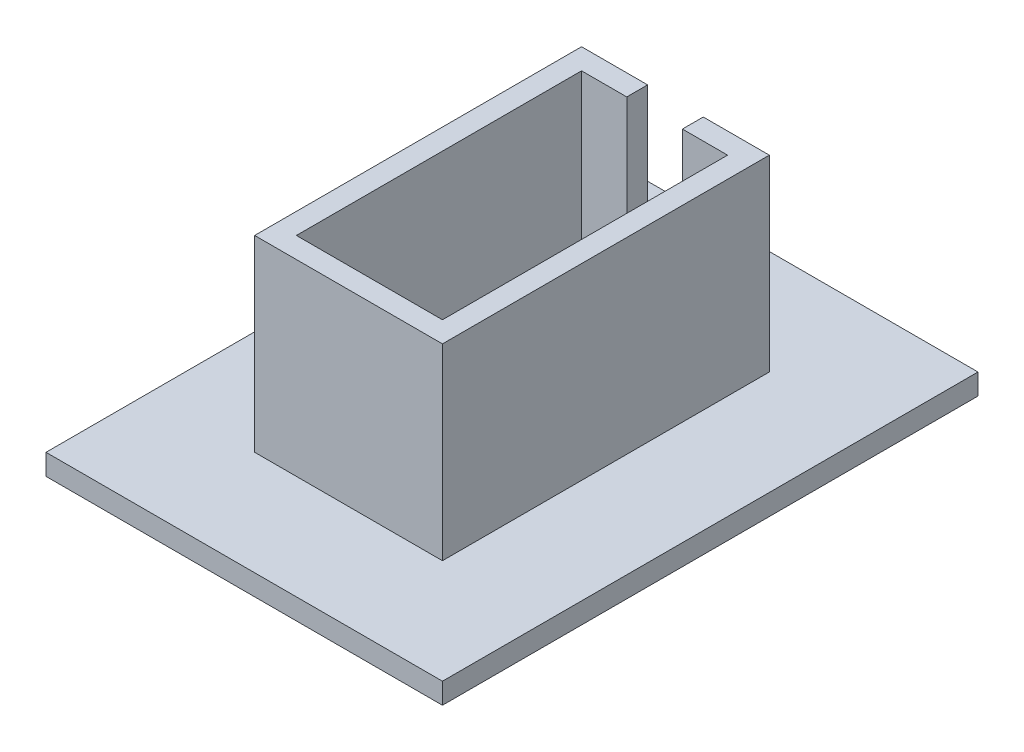
ISO-10303-21;
HEADER;
FILE_DESCRIPTION(('STEP AP214'),'2;1');
FILE_NAME('part.step','',(''),(''),'','','');
FILE_SCHEMA(('AUTOMOTIVE_DESIGN { 1 0 10303 214 1 1 1 1 }'));
ENDSEC;
DATA;
#1=APPLICATION_CONTEXT('core data for automotive mechanical design processes');
#2=APPLICATION_PROTOCOL_DEFINITION('international standard','automotive_design',2000,#1);
#3=PRODUCT_CONTEXT('',#1,'mechanical');
#4=PRODUCT('Part','Part','',(#3));
#5=PRODUCT_RELATED_PRODUCT_CATEGORY('part','',(#4));
#6=PRODUCT_DEFINITION_FORMATION('','',#4);
#7=PRODUCT_DEFINITION_CONTEXT('part definition',#1,'design');
#8=PRODUCT_DEFINITION('design','',#6,#7);
#9=PRODUCT_DEFINITION_SHAPE('','',#8);
#10=(LENGTH_UNIT() NAMED_UNIT(*) SI_UNIT(.MILLI.,.METRE.));
#11=(NAMED_UNIT(*) PLANE_ANGLE_UNIT() SI_UNIT($,.RADIAN.));
#12=(NAMED_UNIT(*) SI_UNIT($,.STERADIAN.) SOLID_ANGLE_UNIT());
#13=UNCERTAINTY_MEASURE_WITH_UNIT(LENGTH_MEASURE(1.E-05),#10,'distance_accuracy_value','');
#14=(GEOMETRIC_REPRESENTATION_CONTEXT(3) GLOBAL_UNCERTAINTY_ASSIGNED_CONTEXT((#13)) GLOBAL_UNIT_ASSIGNED_CONTEXT((#10,
#11,#12)) REPRESENTATION_CONTEXT('',''));
#15=CARTESIAN_POINT('',(0.,0.,0.));
#16=DIRECTION('',(0.,0.,1.));
#17=DIRECTION('',(1.,0.,0.));
#18=AXIS2_PLACEMENT_3D('',#15,#16,#17);
#19=CARTESIAN_POINT('',(-48.3817382307295,30.,-60.6678220382825));
#20=DIRECTION('',(0.,0.,1.));
#21=DIRECTION('',(1.,0.,0.));
#22=AXIS2_PLACEMENT_3D('',#19,#20,#21);
#23=PLANE('',#22);
#24=DIRECTION('',(0.,1.,0.));
#25=VECTOR('',#24,1.);
#26=CARTESIAN_POINT('',(-38.8817382307294,3.,-60.6678220382825));
#27=LINE('',#26,#25);
#28=CARTESIAN_POINT('',(-38.8817382307294,3.,-60.6678220382825));
#29=VERTEX_POINT('',#28);
#30=CARTESIAN_POINT('',(-38.8817382307294,30.,-60.6678220382825));
#31=VERTEX_POINT('',#30);
#32=EDGE_CURVE('E155',#29,#31,#27,.T.);
#33=ORIENTED_EDGE('',*,*,#32,.F.);
#34=DIRECTION('',(-1.,0.,0.));
#35=VECTOR('',#34,1.);
#36=CARTESIAN_POINT('',(-48.3817382307295,3.,-60.6678220382825));
#37=LINE('',#36,#35);
#38=CARTESIAN_POINT('',(-48.3817382307295,3.,-60.6678220382825));
#39=VERTEX_POINT('',#38);
#40=EDGE_CURVE('E172',#29,#39,#37,.T.);
#41=ORIENTED_EDGE('',*,*,#40,.T.);
#42=DIRECTION('',(0.,-1.,0.));
#43=VECTOR('',#42,1.);
#44=CARTESIAN_POINT('',(-48.3817382307295,30.,-60.6678220382825));
#45=LINE('',#44,#43);
#46=CARTESIAN_POINT('',(-48.3817382307295,30.,-60.6678220382825));
#47=VERTEX_POINT('',#46);
#48=EDGE_CURVE('E181',#47,#39,#45,.T.);
#49=ORIENTED_EDGE('',*,*,#48,.F.);
#50=DIRECTION('',(-1.,0.,0.));
#51=VECTOR('',#50,1.);
#52=CARTESIAN_POINT('',(-48.3817382307295,30.,-60.6678220382825));
#53=LINE('',#52,#51);
#54=EDGE_CURVE('E297',#31,#47,#53,.T.);
#55=ORIENTED_EDGE('',*,*,#54,.F.);
#56=EDGE_LOOP('',(#33,#41,#49,#55));
#57=FACE_BOUND('',#56,.T.);
#58=ADVANCED_FACE('F33',(#57),#23,.F.);
#59=CARTESIAN_POINT('',(-45.3817382307295,30.,-57.6678220382825));
#60=DIRECTION('',(0.,0.,1.));
#61=DIRECTION('',(1.,0.,0.));
#62=AXIS2_PLACEMENT_3D('',#59,#60,#61);
#63=PLANE('',#62);
#64=DIRECTION('',(-1.,0.,0.));
#65=VECTOR('',#64,1.);
#66=CARTESIAN_POINT('',(-45.3817382307295,3.,-57.6678220382825));
#67=LINE('',#66,#65);
#68=CARTESIAN_POINT('',(-38.8817382307294,3.,-57.6678220382825));
#69=VERTEX_POINT('',#68);
#70=CARTESIAN_POINT('',(-45.3817382307295,3.,-57.6678220382825));
#71=VERTEX_POINT('',#70);
#72=EDGE_CURVE('E310',#69,#71,#67,.T.);
#73=ORIENTED_EDGE('',*,*,#72,.F.);
#74=DIRECTION('',(0.,1.,0.));
#75=VECTOR('',#74,1.);
#76=CARTESIAN_POINT('',(-38.8817382307294,3.,-57.6678220382825));
#77=LINE('',#76,#75);
#78=CARTESIAN_POINT('',(-38.8817382307294,30.,-57.6678220382825));
#79=VERTEX_POINT('',#78);
#80=EDGE_CURVE('E330',#69,#79,#77,.T.);
#81=ORIENTED_EDGE('',*,*,#80,.T.);
#82=DIRECTION('',(-1.,0.,0.));
#83=VECTOR('',#82,1.);
#84=CARTESIAN_POINT('',(-45.3817382307295,30.,-57.6678220382825));
#85=LINE('',#84,#83);
#86=CARTESIAN_POINT('',(-45.3817382307295,30.,-57.6678220382825));
#87=VERTEX_POINT('',#86);
#88=EDGE_CURVE('E322',#79,#87,#85,.T.);
#89=ORIENTED_EDGE('',*,*,#88,.T.);
#90=DIRECTION('',(0.,-1.,0.));
#91=VECTOR('',#90,1.);
#92=CARTESIAN_POINT('',(-45.3817382307295,30.,-57.6678220382825));
#93=LINE('',#92,#91);
#94=EDGE_CURVE('E304',#87,#71,#93,.T.);
#95=ORIENTED_EDGE('',*,*,#94,.T.);
#96=EDGE_LOOP('',(#73,#81,#89,#95));
#97=FACE_BOUND('',#96,.T.);
#98=ADVANCED_FACE('F247',(#97),#63,.T.);
#99=CARTESIAN_POINT('',(-63.3817382307294,3.,1.33217796171754));
#100=DIRECTION('',(0.,0.,-1.));
#101=DIRECTION('',(-1.,0.,0.));
#102=AXIS2_PLACEMENT_3D('',#99,#100,#101);
#103=PLANE('',#102);
#104=DIRECTION('',(1.,0.,0.));
#105=VECTOR('',#104,1.);
#106=CARTESIAN_POINT('',(-63.3817382307294,0.,1.33217796171754));
#107=LINE('',#106,#105);
#108=CARTESIAN_POINT('',(-63.3817382307294,0.,1.33217796171754));
#109=VERTEX_POINT('',#108);
#110=CARTESIAN_POINT('',(-6.38173823072945,0.,1.33217796171754));
#111=VERTEX_POINT('',#110);
#112=EDGE_CURVE('E191',#109,#111,#107,.T.);
#113=ORIENTED_EDGE('',*,*,#112,.T.);
#114=DIRECTION('',(0.,-1.,0.));
#115=VECTOR('',#114,1.);
#116=CARTESIAN_POINT('',(-6.38173823072945,3.,1.33217796171754));
#117=LINE('',#116,#115);
#118=CARTESIAN_POINT('',(-6.38173823072945,3.,1.33217796171754));
#119=VERTEX_POINT('',#118);
#120=EDGE_CURVE('E11',#119,#111,#117,.T.);
#121=ORIENTED_EDGE('',*,*,#120,.F.);
#122=DIRECTION('',(1.,0.,0.));
#123=VECTOR('',#122,1.);
#124=CARTESIAN_POINT('',(-63.3817382307294,3.,1.33217796171754));
#125=LINE('',#124,#123);
#126=CARTESIAN_POINT('',(-63.3817382307294,3.,1.33217796171754));
#127=VERTEX_POINT('',#126);
#128=EDGE_CURVE('E192',#127,#119,#125,.T.);
#129=ORIENTED_EDGE('',*,*,#128,.F.);
#130=DIRECTION('',(0.,-1.,0.));
#131=VECTOR('',#130,1.);
#132=CARTESIAN_POINT('',(-63.3817382307294,3.,1.33217796171754));
#133=LINE('',#132,#131);
#134=EDGE_CURVE('E203',#127,#109,#133,.T.);
#135=ORIENTED_EDGE('',*,*,#134,.T.);
#136=EDGE_LOOP('',(#113,#121,#129,#135));
#137=FACE_BOUND('',#136,.T.);
#138=ADVANCED_FACE('F35',(#137),#103,.F.);
#139=CARTESIAN_POINT('',(-6.38173823072946,3.,-75.6678220382825));
#140=DIRECTION('',(1.,0.,0.));
#141=DIRECTION('',(0.,0.,-1.));
#142=AXIS2_PLACEMENT_3D('',#139,#140,#141);
#143=PLANE('',#142);
#144=DIRECTION('',(0.,0.,1.));
#145=VECTOR('',#144,1.);
#146=CARTESIAN_POINT('',(-6.38173823072946,0.,-75.6678220382825));
#147=LINE('',#146,#145);
#148=CARTESIAN_POINT('',(-6.38173823072946,0.,-75.6678220382825));
#149=VERTEX_POINT('',#148);
#150=EDGE_CURVE('E206',#149,#111,#147,.T.);
#151=ORIENTED_EDGE('',*,*,#150,.F.);
#152=DIRECTION('',(0.,-1.,0.));
#153=VECTOR('',#152,1.);
#154=CARTESIAN_POINT('',(-6.38173823072946,3.,-75.6678220382825));
#155=LINE('',#154,#153);
#156=CARTESIAN_POINT('',(-6.38173823072946,3.,-75.6678220382825));
#157=VERTEX_POINT('',#156);
#158=EDGE_CURVE('E41',#157,#149,#155,.T.);
#159=ORIENTED_EDGE('',*,*,#158,.F.);
#160=DIRECTION('',(0.,0.,1.));
#161=VECTOR('',#160,1.);
#162=CARTESIAN_POINT('',(-6.38173823072946,3.,-75.6678220382825));
#163=LINE('',#162,#161);
#164=EDGE_CURVE('E194',#157,#119,#163,.T.);
#165=ORIENTED_EDGE('',*,*,#164,.T.);
#166=ORIENTED_EDGE('',*,*,#120,.T.);
#167=EDGE_LOOP('',(#151,#159,#165,#166));
#168=FACE_BOUND('',#167,.T.);
#169=ADVANCED_FACE('F223',(#168),#143,.T.);
#170=CARTESIAN_POINT('',(-63.3817382307294,3.,-75.6678220382825));
#171=DIRECTION('',(0.,0.,-1.));
#172=DIRECTION('',(-1.,0.,0.));
#173=AXIS2_PLACEMENT_3D('',#170,#171,#172);
#174=PLANE('',#173);
#175=DIRECTION('',(1.,0.,0.));
#176=VECTOR('',#175,1.);
#177=CARTESIAN_POINT('',(-63.3817382307294,0.,-75.6678220382825));
#178=LINE('',#177,#176);
#179=CARTESIAN_POINT('',(-63.3817382307294,0.,-75.6678220382825));
#180=VERTEX_POINT('',#179);
#181=EDGE_CURVE('E209',#180,#149,#178,.T.);
#182=ORIENTED_EDGE('',*,*,#181,.F.);
#183=DIRECTION('',(0.,-1.,0.));
#184=VECTOR('',#183,1.);
#185=CARTESIAN_POINT('',(-63.3817382307294,3.,-75.6678220382825));
#186=LINE('',#185,#184);
#187=CARTESIAN_POINT('',(-63.3817382307294,3.,-75.6678220382825));
#188=VERTEX_POINT('',#187);
#189=EDGE_CURVE('E215',#188,#180,#186,.T.);
#190=ORIENTED_EDGE('',*,*,#189,.F.);
#191=DIRECTION('',(1.,0.,0.));
#192=VECTOR('',#191,1.);
#193=CARTESIAN_POINT('',(-63.3817382307294,3.,-75.6678220382825));
#194=LINE('',#193,#192);
#195=EDGE_CURVE('E198',#188,#157,#194,.T.);
#196=ORIENTED_EDGE('',*,*,#195,.T.);
#197=ORIENTED_EDGE('',*,*,#158,.T.);
#198=EDGE_LOOP('',(#182,#190,#196,#197));
#199=FACE_BOUND('',#198,.T.);
#200=ADVANCED_FACE('F219',(#199),#174,.T.);
#201=CARTESIAN_POINT('',(-63.3817382307294,3.,-75.6678220382825));
#202=DIRECTION('',(1.,0.,0.));
#203=DIRECTION('',(0.,0.,-1.));
#204=AXIS2_PLACEMENT_3D('',#201,#202,#203);
#205=PLANE('',#204);
#206=DIRECTION('',(0.,0.,1.));
#207=VECTOR('',#206,1.);
#208=CARTESIAN_POINT('',(-63.3817382307294,0.,-75.6678220382825));
#209=LINE('',#208,#207);
#210=EDGE_CURVE('E195',#180,#109,#209,.T.);
#211=ORIENTED_EDGE('',*,*,#210,.T.);
#212=ORIENTED_EDGE('',*,*,#134,.F.);
#213=DIRECTION('',(0.,0.,1.));
#214=VECTOR('',#213,1.);
#215=CARTESIAN_POINT('',(-63.3817382307294,3.,-75.6678220382825));
#216=LINE('',#215,#214);
#217=EDGE_CURVE('E201',#188,#127,#216,.T.);
#218=ORIENTED_EDGE('',*,*,#217,.F.);
#219=ORIENTED_EDGE('',*,*,#189,.T.);
#220=EDGE_LOOP('',(#211,#212,#218,#219));
#221=FACE_BOUND('',#220,.T.);
#222=ADVANCED_FACE('F231',(#221),#205,.F.);
#223=CARTESIAN_POINT('',(0.,0.,0.));
#224=DIRECTION('',(0.,-1.,0.));
#225=DIRECTION('',(0.,0.,-1.));
#226=AXIS2_PLACEMENT_3D('',#223,#224,#225);
#227=PLANE('',#226);
#228=ORIENTED_EDGE('',*,*,#112,.F.);
#229=ORIENTED_EDGE('',*,*,#210,.F.);
#230=ORIENTED_EDGE('',*,*,#181,.T.);
#231=ORIENTED_EDGE('',*,*,#150,.T.);
#232=EDGE_LOOP('',(#228,#229,#230,#231));
#233=FACE_BOUND('',#232,.T.);
#234=ADVANCED_FACE('F228',(#233),#227,.T.);
#235=CARTESIAN_POINT('',(0.,30.,0.));
#236=DIRECTION('',(0.,1.,0.));
#237=DIRECTION('',(0.,0.,1.));
#238=AXIS2_PLACEMENT_3D('',#235,#236,#237);
#239=PLANE('',#238);
#240=DIRECTION('',(0.,0.,-1.));
#241=VECTOR('',#240,1.);
#242=CARTESIAN_POINT('',(-30.8817382307294,30.,-57.6678220382824));
#243=LINE('',#242,#241);
#244=CARTESIAN_POINT('',(-30.8817382307294,30.,-57.6678220382824));
#245=VERTEX_POINT('',#244);
#246=CARTESIAN_POINT('',(-30.8817382307294,30.,-60.6678220382825));
#247=VERTEX_POINT('',#246);
#248=EDGE_CURVE('E150',#245,#247,#243,.T.);
#249=ORIENTED_EDGE('',*,*,#248,.F.);
#250=CARTESIAN_POINT('',(-24.3817382307295,30.,-57.6678220382825));
#251=VERTEX_POINT('',#250);
#252=EDGE_CURVE('E307',#251,#245,#85,.T.);
#253=ORIENTED_EDGE('',*,*,#252,.F.);
#254=DIRECTION('',(0.,0.,-1.));
#255=VECTOR('',#254,1.);
#256=CARTESIAN_POINT('',(-24.3817382307294,30.,-16.6678220382825));
#257=LINE('',#256,#255);
#258=CARTESIAN_POINT('',(-24.3817382307294,30.,-16.6678220382825));
#259=VERTEX_POINT('',#258);
#260=EDGE_CURVE('E323',#259,#251,#257,.T.);
#261=ORIENTED_EDGE('',*,*,#260,.F.);
#262=DIRECTION('',(1.,0.,0.));
#263=VECTOR('',#262,1.);
#264=CARTESIAN_POINT('',(-45.3817382307294,30.,-16.6678220382825));
#265=LINE('',#264,#263);
#266=CARTESIAN_POINT('',(-45.3817382307294,30.,-16.6678220382825));
#267=VERTEX_POINT('',#266);
#268=EDGE_CURVE('E326',#267,#259,#265,.T.);
#269=ORIENTED_EDGE('',*,*,#268,.F.);
#270=DIRECTION('',(0.,0.,1.));
#271=VECTOR('',#270,1.);
#272=CARTESIAN_POINT('',(-45.3817382307294,30.,-16.6678220382825));
#273=LINE('',#272,#271);
#274=EDGE_CURVE('E309',#87,#267,#273,.T.);
#275=ORIENTED_EDGE('',*,*,#274,.F.);
#276=ORIENTED_EDGE('',*,*,#88,.F.);
#277=DIRECTION('',(0.,0.,-1.));
#278=VECTOR('',#277,1.);
#279=CARTESIAN_POINT('',(-38.8817382307294,30.,-57.6678220382825));
#280=LINE('',#279,#278);
#281=EDGE_CURVE('E165',#79,#31,#280,.T.);
#282=ORIENTED_EDGE('',*,*,#281,.T.);
#283=ORIENTED_EDGE('',*,*,#54,.T.);
#284=DIRECTION('',(0.,0.,1.));
#285=VECTOR('',#284,1.);
#286=CARTESIAN_POINT('',(-48.3817382307295,30.,-60.6678220382825));
#287=LINE('',#286,#285);
#288=CARTESIAN_POINT('',(-48.3817382307294,30.,-13.6678220382825));
#289=VERTEX_POINT('',#288);
#290=EDGE_CURVE('E171',#47,#289,#287,.T.);
#291=ORIENTED_EDGE('',*,*,#290,.T.);
#292=DIRECTION('',(1.,0.,0.));
#293=VECTOR('',#292,1.);
#294=CARTESIAN_POINT('',(-48.3817382307294,30.,-13.6678220382825));
#295=LINE('',#294,#293);
#296=CARTESIAN_POINT('',(-21.3817382307294,30.,-13.6678220382825));
#297=VERTEX_POINT('',#296);
#298=EDGE_CURVE('E175',#289,#297,#295,.T.);
#299=ORIENTED_EDGE('',*,*,#298,.T.);
#300=DIRECTION('',(0.,0.,-1.));
#301=VECTOR('',#300,1.);
#302=CARTESIAN_POINT('',(-21.3817382307295,30.,-60.6678220382825));
#303=LINE('',#302,#301);
#304=CARTESIAN_POINT('',(-21.3817382307295,30.,-60.6678220382825));
#305=VERTEX_POINT('',#304);
#306=EDGE_CURVE('E298',#297,#305,#303,.T.);
#307=ORIENTED_EDGE('',*,*,#306,.T.);
#308=EDGE_CURVE('E184',#305,#247,#53,.T.);
#309=ORIENTED_EDGE('',*,*,#308,.T.);
#310=EDGE_LOOP('',(#249,#253,#261,#269,#275,#276,#282,#283,#291,#299,#307,#309));
#311=FACE_BOUND('',#310,.T.);
#312=ADVANCED_FACE('F279',(#311),#239,.T.);
#313=CARTESIAN_POINT('',(-48.3817382307295,30.,-60.6678220382825));
#314=DIRECTION('',(1.,0.,0.));
#315=DIRECTION('',(0.,0.,-1.));
#316=AXIS2_PLACEMENT_3D('',#313,#314,#315);
#317=PLANE('',#316);
#318=DIRECTION('',(0.,0.,1.));
#319=VECTOR('',#318,1.);
#320=CARTESIAN_POINT('',(-48.3817382307295,3.,-60.6678220382825));
#321=LINE('',#320,#319);
#322=CARTESIAN_POINT('',(-48.3817382307294,3.,-13.6678220382825));
#323=VERTEX_POINT('',#322);
#324=EDGE_CURVE('E287',#39,#323,#321,.T.);
#325=ORIENTED_EDGE('',*,*,#324,.T.);
#326=DIRECTION('',(0.,-1.,0.));
#327=VECTOR('',#326,1.);
#328=CARTESIAN_POINT('',(-48.3817382307294,30.,-13.6678220382825));
#329=LINE('',#328,#327);
#330=EDGE_CURVE('E189',#289,#323,#329,.T.);
#331=ORIENTED_EDGE('',*,*,#330,.F.);
#332=ORIENTED_EDGE('',*,*,#290,.F.);
#333=ORIENTED_EDGE('',*,*,#48,.T.);
#334=EDGE_LOOP('',(#325,#331,#332,#333));
#335=FACE_BOUND('',#334,.T.);
#336=ADVANCED_FACE('F275',(#335),#317,.F.);
#337=CARTESIAN_POINT('',(-48.3817382307294,30.,-13.6678220382825));
#338=DIRECTION('',(0.,0.,-1.));
#339=DIRECTION('',(-1.,0.,0.));
#340=AXIS2_PLACEMENT_3D('',#337,#338,#339);
#341=PLANE('',#340);
#342=DIRECTION('',(1.,0.,0.));
#343=VECTOR('',#342,1.);
#344=CARTESIAN_POINT('',(-48.3817382307294,3.,-13.6678220382825));
#345=LINE('',#344,#343);
#346=CARTESIAN_POINT('',(-21.3817382307294,3.,-13.6678220382825));
#347=VERTEX_POINT('',#346);
#348=EDGE_CURVE('E55',#323,#347,#345,.T.);
#349=ORIENTED_EDGE('',*,*,#348,.T.);
#350=DIRECTION('',(0.,-1.,0.));
#351=VECTOR('',#350,1.);
#352=CARTESIAN_POINT('',(-21.3817382307294,30.,-13.6678220382825));
#353=LINE('',#352,#351);
#354=EDGE_CURVE('E186',#297,#347,#353,.T.);
#355=ORIENTED_EDGE('',*,*,#354,.F.);
#356=ORIENTED_EDGE('',*,*,#298,.F.);
#357=ORIENTED_EDGE('',*,*,#330,.T.);
#358=EDGE_LOOP('',(#349,#355,#356,#357));
#359=FACE_BOUND('',#358,.T.);
#360=ADVANCED_FACE('F270',(#359),#341,.F.);
#361=CARTESIAN_POINT('',(-21.3817382307295,30.,-60.6678220382825));
#362=DIRECTION('',(-1.,0.,0.));
#363=DIRECTION('',(0.,0.,1.));
#364=AXIS2_PLACEMENT_3D('',#361,#362,#363);
#365=PLANE('',#364);
#366=DIRECTION('',(0.,0.,-1.));
#367=VECTOR('',#366,1.);
#368=CARTESIAN_POINT('',(-21.3817382307295,3.,-60.6678220382825));
#369=LINE('',#368,#367);
#370=CARTESIAN_POINT('',(-21.3817382307295,3.,-60.6678220382825));
#371=VERTEX_POINT('',#370);
#372=EDGE_CURVE('E177',#347,#371,#369,.T.);
#373=ORIENTED_EDGE('',*,*,#372,.T.);
#374=DIRECTION('',(0.,-1.,0.));
#375=VECTOR('',#374,1.);
#376=CARTESIAN_POINT('',(-21.3817382307295,30.,-60.6678220382825));
#377=LINE('',#376,#375);
#378=EDGE_CURVE('E170',#305,#371,#377,.T.);
#379=ORIENTED_EDGE('',*,*,#378,.F.);
#380=ORIENTED_EDGE('',*,*,#306,.F.);
#381=ORIENTED_EDGE('',*,*,#354,.T.);
#382=EDGE_LOOP('',(#373,#379,#380,#381));
#383=FACE_BOUND('',#382,.T.);
#384=ADVANCED_FACE('F262',(#383),#365,.F.);
#385=CARTESIAN_POINT('',(-30.8817382307294,3.,-60.6678220382825));
#386=VERTEX_POINT('',#385);
#387=EDGE_CURVE('E160',#371,#386,#37,.T.);
#388=ORIENTED_EDGE('',*,*,#387,.T.);
#389=DIRECTION('',(0.,1.,0.));
#390=VECTOR('',#389,1.);
#391=CARTESIAN_POINT('',(-30.8817382307294,3.,-60.6678220382825));
#392=LINE('',#391,#390);
#393=EDGE_CURVE('E144',#386,#247,#392,.T.);
#394=ORIENTED_EDGE('',*,*,#393,.T.);
#395=ORIENTED_EDGE('',*,*,#308,.F.);
#396=ORIENTED_EDGE('',*,*,#378,.T.);
#397=EDGE_LOOP('',(#388,#394,#395,#396));
#398=FACE_BOUND('',#397,.T.);
#399=ADVANCED_FACE('F168',(#398),#23,.F.);
#400=CARTESIAN_POINT('',(-45.3817382307294,30.,-16.6678220382825));
#401=DIRECTION('',(1.,0.,0.));
#402=DIRECTION('',(0.,0.,-1.));
#403=AXIS2_PLACEMENT_3D('',#400,#401,#402);
#404=PLANE('',#403);
#405=DIRECTION('',(0.,0.,1.));
#406=VECTOR('',#405,1.);
#407=CARTESIAN_POINT('',(-45.3817382307294,3.,-16.6678220382825));
#408=LINE('',#407,#406);
#409=CARTESIAN_POINT('',(-45.3817382307294,3.,-16.6678220382825));
#410=VERTEX_POINT('',#409);
#411=EDGE_CURVE('E316',#71,#410,#408,.T.);
#412=ORIENTED_EDGE('',*,*,#411,.F.);
#413=ORIENTED_EDGE('',*,*,#94,.F.);
#414=ORIENTED_EDGE('',*,*,#274,.T.);
#415=DIRECTION('',(0.,-1.,0.));
#416=VECTOR('',#415,1.);
#417=CARTESIAN_POINT('',(-45.3817382307294,30.,-16.6678220382825));
#418=LINE('',#417,#416);
#419=EDGE_CURVE('E290',#267,#410,#418,.T.);
#420=ORIENTED_EDGE('',*,*,#419,.T.);
#421=EDGE_LOOP('',(#412,#413,#414,#420));
#422=FACE_BOUND('',#421,.T.);
#423=ADVANCED_FACE('F261',(#422),#404,.T.);
#424=CARTESIAN_POINT('',(-45.3817382307294,30.,-16.6678220382825));
#425=DIRECTION('',(0.,0.,-1.));
#426=DIRECTION('',(-1.,0.,0.));
#427=AXIS2_PLACEMENT_3D('',#424,#425,#426);
#428=PLANE('',#427);
#429=DIRECTION('',(1.,0.,0.));
#430=VECTOR('',#429,1.);
#431=CARTESIAN_POINT('',(-45.3817382307294,3.,-16.6678220382825));
#432=LINE('',#431,#430);
#433=CARTESIAN_POINT('',(-24.3817382307294,3.,-16.6678220382825));
#434=VERTEX_POINT('',#433);
#435=EDGE_CURVE('E313',#410,#434,#432,.T.);
#436=ORIENTED_EDGE('',*,*,#435,.F.);
#437=ORIENTED_EDGE('',*,*,#419,.F.);
#438=ORIENTED_EDGE('',*,*,#268,.T.);
#439=DIRECTION('',(0.,-1.,0.));
#440=VECTOR('',#439,1.);
#441=CARTESIAN_POINT('',(-24.3817382307294,30.,-16.6678220382825));
#442=LINE('',#441,#440);
#443=EDGE_CURVE('E293',#259,#434,#442,.T.);
#444=ORIENTED_EDGE('',*,*,#443,.T.);
#445=EDGE_LOOP('',(#436,#437,#438,#444));
#446=FACE_BOUND('',#445,.T.);
#447=ADVANCED_FACE('F267',(#446),#428,.T.);
#448=CARTESIAN_POINT('',(-24.3817382307294,30.,-16.6678220382825));
#449=DIRECTION('',(-1.,0.,0.));
#450=DIRECTION('',(0.,0.,1.));
#451=AXIS2_PLACEMENT_3D('',#448,#449,#450);
#452=PLANE('',#451);
#453=DIRECTION('',(0.,0.,-1.));
#454=VECTOR('',#453,1.);
#455=CARTESIAN_POINT('',(-24.3817382307294,3.,-16.6678220382825));
#456=LINE('',#455,#454);
#457=CARTESIAN_POINT('',(-24.3817382307295,3.,-57.6678220382825));
#458=VERTEX_POINT('',#457);
#459=EDGE_CURVE('E311',#434,#458,#456,.T.);
#460=ORIENTED_EDGE('',*,*,#459,.F.);
#461=ORIENTED_EDGE('',*,*,#443,.F.);
#462=ORIENTED_EDGE('',*,*,#260,.T.);
#463=DIRECTION('',(0.,-1.,0.));
#464=VECTOR('',#463,1.);
#465=CARTESIAN_POINT('',(-24.3817382307295,30.,-57.6678220382825));
#466=LINE('',#465,#464);
#467=EDGE_CURVE('E302',#251,#458,#466,.T.);
#468=ORIENTED_EDGE('',*,*,#467,.T.);
#469=EDGE_LOOP('',(#460,#461,#462,#468));
#470=FACE_BOUND('',#469,.T.);
#471=ADVANCED_FACE('F244',(#470),#452,.T.);
#472=DIRECTION('',(0.,1.,0.));
#473=VECTOR('',#472,1.);
#474=CARTESIAN_POINT('',(-30.8817382307294,3.,-57.6678220382824));
#475=LINE('',#474,#473);
#476=CARTESIAN_POINT('',(-30.8817382307294,3.,-57.6678220382824));
#477=VERTEX_POINT('',#476);
#478=EDGE_CURVE('E319',#477,#245,#475,.T.);
#479=ORIENTED_EDGE('',*,*,#478,.F.);
#480=EDGE_CURVE('E164',#458,#477,#67,.T.);
#481=ORIENTED_EDGE('',*,*,#480,.F.);
#482=ORIENTED_EDGE('',*,*,#467,.F.);
#483=ORIENTED_EDGE('',*,*,#252,.T.);
#484=EDGE_LOOP('',(#479,#481,#482,#483));
#485=FACE_BOUND('',#484,.T.);
#486=ADVANCED_FACE('F236',(#485),#63,.T.);
#487=CARTESIAN_POINT('',(0.,3.,0.));
#488=DIRECTION('',(0.,-1.,0.));
#489=DIRECTION('',(0.,0.,-1.));
#490=AXIS2_PLACEMENT_3D('',#487,#488,#489);
#491=PLANE('',#490);
#492=ORIENTED_EDGE('',*,*,#480,.T.);
#493=DIRECTION('',(0.,0.,-1.));
#494=VECTOR('',#493,1.);
#495=CARTESIAN_POINT('',(-30.8817382307294,3.,-57.6678220382824));
#496=LINE('',#495,#494);
#497=EDGE_CURVE('E147',#477,#386,#496,.T.);
#498=ORIENTED_EDGE('',*,*,#497,.T.);
#499=ORIENTED_EDGE('',*,*,#387,.F.);
#500=ORIENTED_EDGE('',*,*,#372,.F.);
#501=ORIENTED_EDGE('',*,*,#348,.F.);
#502=ORIENTED_EDGE('',*,*,#324,.F.);
#503=ORIENTED_EDGE('',*,*,#40,.F.);
#504=DIRECTION('',(0.,0.,-1.));
#505=VECTOR('',#504,1.);
#506=CARTESIAN_POINT('',(-38.8817382307294,3.,-57.6678220382825));
#507=LINE('',#506,#505);
#508=EDGE_CURVE('E48',#69,#29,#507,.T.);
#509=ORIENTED_EDGE('',*,*,#508,.F.);
#510=ORIENTED_EDGE('',*,*,#72,.T.);
#511=ORIENTED_EDGE('',*,*,#411,.T.);
#512=ORIENTED_EDGE('',*,*,#435,.T.);
#513=ORIENTED_EDGE('',*,*,#459,.T.);
#514=EDGE_LOOP('',(#492,#498,#499,#500,#501,#502,#503,#509,#510,#511,#512,#513));
#515=FACE_BOUND('',#514,.T.);
#516=ORIENTED_EDGE('',*,*,#128,.T.);
#517=ORIENTED_EDGE('',*,*,#164,.F.);
#518=ORIENTED_EDGE('',*,*,#195,.F.);
#519=ORIENTED_EDGE('',*,*,#217,.T.);
#520=EDGE_LOOP('',(#516,#517,#518,#519));
#521=FACE_BOUND('',#520,.T.);
#522=ADVANCED_FACE('F158',(#515,#521),#491,.F.);
#523=CARTESIAN_POINT('',(-30.8817382307294,3.,-57.6678220382824));
#524=DIRECTION('',(1.,0.,0.));
#525=DIRECTION('',(0.,0.,-1.));
#526=AXIS2_PLACEMENT_3D('',#523,#524,#525);
#527=PLANE('',#526);
#528=ORIENTED_EDGE('',*,*,#248,.T.);
#529=ORIENTED_EDGE('',*,*,#393,.F.);
#530=ORIENTED_EDGE('',*,*,#497,.F.);
#531=ORIENTED_EDGE('',*,*,#478,.T.);
#532=EDGE_LOOP('',(#528,#529,#530,#531));
#533=FACE_BOUND('',#532,.T.);
#534=ADVANCED_FACE('F146',(#533),#527,.F.);
#535=CARTESIAN_POINT('',(-38.8817382307294,3.,-57.6678220382825));
#536=DIRECTION('',(1.,0.,0.));
#537=DIRECTION('',(0.,0.,-1.));
#538=AXIS2_PLACEMENT_3D('',#535,#536,#537);
#539=PLANE('',#538);
#540=ORIENTED_EDGE('',*,*,#281,.F.);
#541=ORIENTED_EDGE('',*,*,#80,.F.);
#542=ORIENTED_EDGE('',*,*,#508,.T.);
#543=ORIENTED_EDGE('',*,*,#32,.T.);
#544=EDGE_LOOP('',(#540,#541,#542,#543));
#545=FACE_BOUND('',#544,.T.);
#546=ADVANCED_FACE('F242',(#545),#539,.T.);
#547=CLOSED_SHELL('',(#58,#98,#138,#169,#200,#222,#234,#312,#336,#360,#384,#399,#423,#447,#471,
#486,#522,#534,#546));
#548=MANIFOLD_SOLID_BREP('B2',#547);
#549=ADVANCED_BREP_SHAPE_REPRESENTATION('',(#18,#548),#14);
#550=SHAPE_DEFINITION_REPRESENTATION(#9,#549);
ENDSEC;
END-ISO-10303-21;
